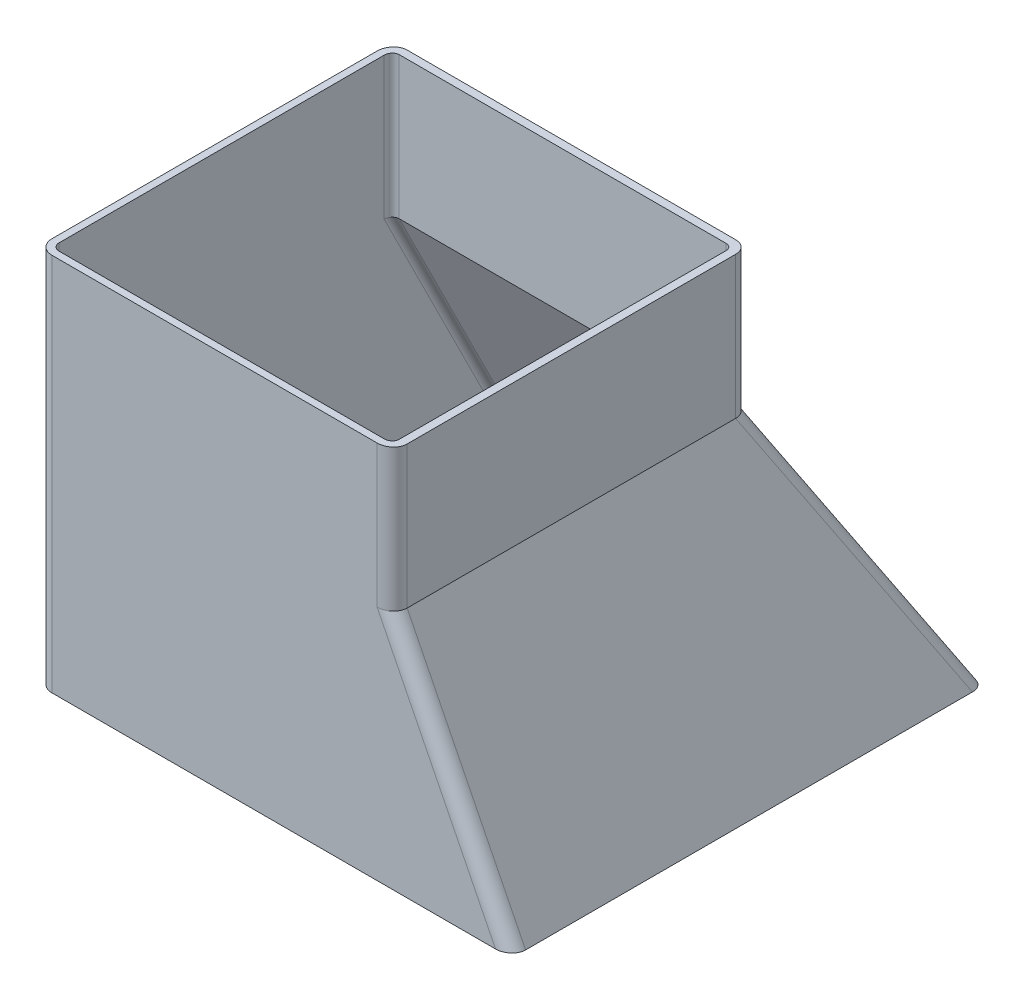
ISO-10303-21;
HEADER;
FILE_DESCRIPTION(('STEP AP214'),'2;1');
FILE_NAME('part.step','',(''),(''),'','','');
FILE_SCHEMA(('AUTOMOTIVE_DESIGN { 1 0 10303 214 1 1 1 1 }'));
ENDSEC;
DATA;
#1=APPLICATION_CONTEXT('core data for automotive mechanical design processes');
#2=APPLICATION_PROTOCOL_DEFINITION('international standard','automotive_design',2000,#1);
#3=PRODUCT_CONTEXT('',#1,'mechanical');
#4=PRODUCT('Part','Part','',(#3));
#5=PRODUCT_RELATED_PRODUCT_CATEGORY('part','',(#4));
#6=PRODUCT_DEFINITION_FORMATION('','',#4);
#7=PRODUCT_DEFINITION_CONTEXT('part definition',#1,'design');
#8=PRODUCT_DEFINITION('design','',#6,#7);
#9=PRODUCT_DEFINITION_SHAPE('','',#8);
#10=(LENGTH_UNIT() NAMED_UNIT(*) SI_UNIT(.MILLI.,.METRE.));
#11=(NAMED_UNIT(*) PLANE_ANGLE_UNIT() SI_UNIT($,.RADIAN.));
#12=(NAMED_UNIT(*) SI_UNIT($,.STERADIAN.) SOLID_ANGLE_UNIT());
#13=UNCERTAINTY_MEASURE_WITH_UNIT(LENGTH_MEASURE(1.E-05),#10,'distance_accuracy_value','');
#14=(GEOMETRIC_REPRESENTATION_CONTEXT(3) GLOBAL_UNCERTAINTY_ASSIGNED_CONTEXT((#13)) GLOBAL_UNIT_ASSIGNED_CONTEXT((#10,
#11,#12)) REPRESENTATION_CONTEXT('',''));
#15=CARTESIAN_POINT('',(0.,0.,0.));
#16=DIRECTION('',(0.,0.,1.));
#17=DIRECTION('',(1.,0.,0.));
#18=AXIS2_PLACEMENT_3D('',#15,#16,#17);
#19=CARTESIAN_POINT('',(71.9813082303753,80.,-73.3229490168752));
#20=DIRECTION('',(0.,0.,1.));
#21=DIRECTION('',(1.,0.,0.));
#22=AXIS2_PLACEMENT_3D('',#19,#20,#21);
#23=PLANE('',#22);
#24=DIRECTION('',(-1.,0.,0.));
#25=VECTOR('',#24,1.);
#26=CARTESIAN_POINT('',(0.,50.,-73.3229490168752));
#27=LINE('',#26,#25);
#28=CARTESIAN_POINT('',(71.9813082303753,50.,-73.3229490168752));
#29=VERTEX_POINT('',#28);
#30=CARTESIAN_POINT('',(3.,50.,-73.3229490168752));
#31=VERTEX_POINT('',#30);
#32=EDGE_CURVE('E233',#29,#31,#27,.T.);
#33=ORIENTED_EDGE('',*,*,#32,.F.);
#34=DIRECTION('',(0.,-1.,0.));
#35=VECTOR('',#34,1.);
#36=CARTESIAN_POINT('',(71.9813082303753,80.,-73.3229490168752));
#37=LINE('',#36,#35);
#38=CARTESIAN_POINT('',(71.9813082303753,80.,-73.3229490168752));
#39=VERTEX_POINT('',#38);
#40=EDGE_CURVE('E11',#39,#29,#37,.T.);
#41=ORIENTED_EDGE('',*,*,#40,.F.);
#42=DIRECTION('',(-1.,0.,0.));
#43=VECTOR('',#42,1.);
#44=CARTESIAN_POINT('',(71.9813082303753,80.,-73.3229490168752));
#45=LINE('',#44,#43);
#46=CARTESIAN_POINT('',(3.,80.,-73.3229490168752));
#47=VERTEX_POINT('',#46);
#48=EDGE_CURVE('E151',#39,#47,#45,.T.);
#49=ORIENTED_EDGE('',*,*,#48,.T.);
#50=DIRECTION('',(0.,-1.,0.));
#51=VECTOR('',#50,1.);
#52=CARTESIAN_POINT('',(3.,80.,-73.3229490168752));
#53=LINE('',#52,#51);
#54=EDGE_CURVE('E136',#47,#31,#53,.T.);
#55=ORIENTED_EDGE('',*,*,#54,.T.);
#56=EDGE_LOOP('',(#33,#41,#49,#55));
#57=FACE_BOUND('',#56,.T.);
#58=ADVANCED_FACE('F17',(#57),#23,.T.);
#59=CARTESIAN_POINT('',(73.3229490168752,80.,-71.9813082303753));
#60=CARTESIAN_POINT('',(73.3229490168752,50.,-71.9813082303753));
#61=CARTESIAN_POINT('',(73.3229490168752,80.,-72.7966488864589));
#62=CARTESIAN_POINT('',(73.3229490168752,50.,-72.7966488864589));
#63=CARTESIAN_POINT('',(72.7966488864589,80.,-73.3229490168752));
#64=CARTESIAN_POINT('',(72.7966488864589,50.,-73.3229490168752));
#65=CARTESIAN_POINT('',(71.9813082303753,80.,-73.3229490168752));
#66=CARTESIAN_POINT('',(71.9813082303753,50.,-73.3229490168752));
#67=(BOUNDED_SURFACE() B_SPLINE_SURFACE(3,1,((#59,#60),(#61,#62),(#63,#64),(#65,#66)),
.UNSPECIFIED.,.F.,.F.,.F.) B_SPLINE_SURFACE_WITH_KNOTS((4,4),(2,2),(0.,1.),(0.,1.),
.UNSPECIFIED.) GEOMETRIC_REPRESENTATION_ITEM() RATIONAL_B_SPLINE_SURFACE(((1.,1.),
(0.849731112827655,0.849731112827655),(0.849731112827655,0.849731112827655),(1.,1.))) REPRESENTATION_ITEM('') SURFACE());
#68=CARTESIAN_POINT('',(71.9813082303753,50.,-73.3229490168752));
#69=CARTESIAN_POINT('',(72.7966488864589,50.,-73.3229490168752));
#70=CARTESIAN_POINT('',(73.3229490168752,50.,-72.796648886459));
#71=CARTESIAN_POINT('',(73.3229490168752,50.,-71.9813082303753));
#72=(BOUNDED_CURVE() B_SPLINE_CURVE(3,(#68,#69,#70,#71),.UNSPECIFIED.,.F.,
.F.) B_SPLINE_CURVE_WITH_KNOTS((4,4),(2.45687345058751,3.82631185659208),
.UNSPECIFIED.) CURVE() GEOMETRIC_REPRESENTATION_ITEM() RATIONAL_B_SPLINE_CURVE((1.,
0.849731112827657,0.849731112827657,1.)) REPRESENTATION_ITEM(''));
#73=CARTESIAN_POINT('',(73.3229490168752,50.,-71.9813082303753));
#74=VERTEX_POINT('',#73);
#75=EDGE_CURVE('E297',#29,#74,#72,.T.);
#76=DIRECTION('',(0.,-1.,0.));
#77=VECTOR('',#76,1.);
#78=CARTESIAN_POINT('',(73.3229490168752,80.,-71.9813082303753));
#79=LINE('',#78,#77);
#80=CARTESIAN_POINT('',(73.3229490168752,80.,-71.9813082303753));
#81=VERTEX_POINT('',#80);
#82=EDGE_CURVE('E25',#81,#74,#79,.T.);
#83=CARTESIAN_POINT('',(73.3229490168752,80.,-71.9813082303753));
#84=CARTESIAN_POINT('',(73.3229490168752,80.,-72.7966488864589));
#85=CARTESIAN_POINT('',(72.7966488864589,80.,-73.3229490168752));
#86=CARTESIAN_POINT('',(71.9813082303753,80.,-73.3229490168752));
#87=(BOUNDED_CURVE() B_SPLINE_CURVE(3,(#83,#84,#85,#86),.UNSPECIFIED.,.F.,
.F.) B_SPLINE_CURVE_WITH_KNOTS((4,4),(2.45687345058751,3.82631185659208),
.UNSPECIFIED.) CURVE() GEOMETRIC_REPRESENTATION_ITEM() RATIONAL_B_SPLINE_CURVE((1.,
0.849731112827655,0.849731112827655,1.)) REPRESENTATION_ITEM(''));
#88=EDGE_CURVE('E155',#81,#39,#87,.T.);
#89=ORIENTED_EDGE('',*,*,#75,.T.);
#90=ORIENTED_EDGE('',*,*,#82,.F.);
#91=ORIENTED_EDGE('',*,*,#88,.T.);
#92=ORIENTED_EDGE('',*,*,#40,.T.);
#93=EDGE_LOOP('',(#89,#90,#91,#92));
#94=FACE_BOUND('',#93,.T.);
#95=ADVANCED_FACE('F1073',(#94),#67,.T.);
#96=CARTESIAN_POINT('',(73.3229490168752,80.,-3.));
#97=DIRECTION('',(-1.,0.,0.));
#98=DIRECTION('',(0.,1.,0.));
#99=AXIS2_PLACEMENT_3D('',#96,#97,#98);
#100=PLANE('',#99);
#101=DIRECTION('',(0.,0.,-1.));
#102=VECTOR('',#101,1.);
#103=CARTESIAN_POINT('',(73.3229490168752,50.,0.));
#104=LINE('',#103,#102);
#105=CARTESIAN_POINT('',(73.3229490168752,50.,-3.));
#106=VERTEX_POINT('',#105);
#107=EDGE_CURVE('E262',#106,#74,#104,.T.);
#108=ORIENTED_EDGE('',*,*,#107,.F.);
#109=DIRECTION('',(0.,-1.,0.));
#110=VECTOR('',#109,1.);
#111=CARTESIAN_POINT('',(73.3229490168752,80.,-3.));
#112=LINE('',#111,#110);
#113=CARTESIAN_POINT('',(73.3229490168752,80.,-3.));
#114=VERTEX_POINT('',#113);
#115=EDGE_CURVE('E38',#114,#106,#112,.T.);
#116=ORIENTED_EDGE('',*,*,#115,.F.);
#117=DIRECTION('',(0.,0.,-1.));
#118=VECTOR('',#117,1.);
#119=CARTESIAN_POINT('',(73.3229490168752,80.,-3.));
#120=LINE('',#119,#118);
#121=EDGE_CURVE('E186',#114,#81,#120,.T.);
#122=ORIENTED_EDGE('',*,*,#121,.T.);
#123=ORIENTED_EDGE('',*,*,#82,.T.);
#124=EDGE_LOOP('',(#108,#116,#122,#123));
#125=FACE_BOUND('',#124,.T.);
#126=ADVANCED_FACE('F1068',(#125),#100,.T.);
#127=CARTESIAN_POINT('',(71.6458980337503,80.,-1.5));
#128=CARTESIAN_POINT('',(71.6458980337503,50.,-1.5));
#129=CARTESIAN_POINT('',(72.6282917548738,80.0000000000001,-1.49999999999999));
#130=CARTESIAN_POINT('',(72.6282917548738,50.,-1.49999999999999));
#131=CARTESIAN_POINT('',(73.3229490168752,80.0000000000001,-2.12132034355964));
#132=CARTESIAN_POINT('',(73.3229490168752,50.,-2.12132034355964));
#133=CARTESIAN_POINT('',(73.3229490168752,80.,-3.));
#134=CARTESIAN_POINT('',(73.3229490168752,50.,-3.));
#135=(BOUNDED_SURFACE() B_SPLINE_SURFACE(3,1,((#127,#128),(#129,#130),(#131,#132),(#133,#134)),
.UNSPECIFIED.,.F.,.F.,.F.) B_SPLINE_SURFACE_WITH_KNOTS((4,4),(2,2),(0.,1.),(0.,1.),
.UNSPECIFIED.) GEOMETRIC_REPRESENTATION_ITEM() RATIONAL_B_SPLINE_SURFACE(((1.,1.),
(0.804737854124363,0.804737854124363),(0.804737854124363,0.804737854124363),(1.,1.))) REPRESENTATION_ITEM('') SURFACE());
#136=CARTESIAN_POINT('',(73.3229490168752,50.,-3.));
#137=CARTESIAN_POINT('',(73.3229490168752,50.,-2.12132034355964));
#138=CARTESIAN_POINT('',(72.6282917548738,50.,-1.49999999999999));
#139=CARTESIAN_POINT('',(71.6458980337503,50.,-1.5));
#140=(BOUNDED_CURVE() B_SPLINE_CURVE(3,(#136,#137,#138,#139),.UNSPECIFIED.,.F.,
.F.) B_SPLINE_CURVE_WITH_KNOTS((4,4),(3.1415926535898,4.7123889803847),
.UNSPECIFIED.) CURVE() GEOMETRIC_REPRESENTATION_ITEM() RATIONAL_B_SPLINE_CURVE((1.,
0.804737854124363,0.804737854124363,1.)) REPRESENTATION_ITEM(''));
#141=CARTESIAN_POINT('',(71.6458980337503,50.,-1.5));
#142=VERTEX_POINT('',#141);
#143=EDGE_CURVE('E292',#106,#142,#140,.T.);
#144=DIRECTION('',(0.,-1.,0.));
#145=VECTOR('',#144,1.);
#146=CARTESIAN_POINT('',(71.6458980337503,80.,-1.5));
#147=LINE('',#146,#145);
#148=CARTESIAN_POINT('',(71.6458980337503,80.,-1.5));
#149=VERTEX_POINT('',#148);
#150=EDGE_CURVE('E218',#149,#142,#147,.T.);
#151=CARTESIAN_POINT('',(71.6458980337503,80.,-1.5));
#152=CARTESIAN_POINT('',(72.6282917548738,80.0000000000001,-1.49999999999999));
#153=CARTESIAN_POINT('',(73.3229490168752,80.0000000000001,-2.12132034355964));
#154=CARTESIAN_POINT('',(73.3229490168752,80.,-3.));
#155=(BOUNDED_CURVE() B_SPLINE_CURVE(3,(#151,#152,#153,#154),.UNSPECIFIED.,.F.,
.F.) B_SPLINE_CURVE_WITH_KNOTS((4,4),(1.57079632679489,3.1415926535898),
.UNSPECIFIED.) CURVE() GEOMETRIC_REPRESENTATION_ITEM() RATIONAL_B_SPLINE_CURVE((1.,
0.804737854124363,0.804737854124363,1.)) REPRESENTATION_ITEM(''));
#156=EDGE_CURVE('E177',#149,#114,#155,.T.);
#157=ORIENTED_EDGE('',*,*,#143,.T.);
#158=ORIENTED_EDGE('',*,*,#150,.F.);
#159=ORIENTED_EDGE('',*,*,#156,.T.);
#160=ORIENTED_EDGE('',*,*,#115,.T.);
#161=EDGE_LOOP('',(#157,#158,#159,#160));
#162=FACE_BOUND('',#161,.T.);
#163=ADVANCED_FACE('F1006',(#162),#135,.T.);
#164=CARTESIAN_POINT('',(3.,80.,-73.3229490168752));
#165=CARTESIAN_POINT('',(3.,50.,-73.3229490168752));
#166=CARTESIAN_POINT('',(2.12132034355965,80.,-73.3229490168753));
#167=CARTESIAN_POINT('',(2.12132034355965,50.,-73.3229490168753));
#168=CARTESIAN_POINT('',(1.5,80.,-72.6282917548737));
#169=CARTESIAN_POINT('',(1.5,50.,-72.6282917548737));
#170=CARTESIAN_POINT('',(1.5,80.,-71.6458980337503));
#171=CARTESIAN_POINT('',(1.5,50.,-71.6458980337503));
#172=(BOUNDED_SURFACE() B_SPLINE_SURFACE(3,1,((#164,#165),(#166,#167),(#168,#169),(#170,#171)),
.UNSPECIFIED.,.F.,.F.,.F.) B_SPLINE_SURFACE_WITH_KNOTS((4,4),(2,2),(0.,1.),(0.,1.),
.UNSPECIFIED.) GEOMETRIC_REPRESENTATION_ITEM() RATIONAL_B_SPLINE_SURFACE(((1.,1.),
(0.804737854124365,0.804737854124365),(0.804737854124365,0.804737854124365),(1.,1.))) REPRESENTATION_ITEM('') SURFACE());
#173=CARTESIAN_POINT('',(1.5,50.,-71.6458980337503));
#174=CARTESIAN_POINT('',(1.5,50.,-72.6282917548737));
#175=CARTESIAN_POINT('',(2.12132034355964,50.,-73.3229490168751));
#176=CARTESIAN_POINT('',(3.,50.,-73.3229490168752));
#177=(BOUNDED_CURVE() B_SPLINE_CURVE(3,(#173,#174,#175,#176),.UNSPECIFIED.,.F.,
.F.) B_SPLINE_CURVE_WITH_KNOTS((4,4),(1.5707963267949,3.1415926535898),
.UNSPECIFIED.) CURVE() GEOMETRIC_REPRESENTATION_ITEM() RATIONAL_B_SPLINE_CURVE((1.,
0.804737854124365,0.804737854124365,1.)) REPRESENTATION_ITEM(''));
#178=CARTESIAN_POINT('',(1.5,50.,-71.6458980337503));
#179=VERTEX_POINT('',#178);
#180=EDGE_CURVE('E143',#179,#31,#177,.T.);
#181=CARTESIAN_POINT('',(3.,80.,-73.3229490168752));
#182=CARTESIAN_POINT('',(2.12132034355965,80.,-73.3229490168753));
#183=CARTESIAN_POINT('',(1.5,80.,-72.6282917548737));
#184=CARTESIAN_POINT('',(1.5,80.,-71.6458980337503));
#185=(BOUNDED_CURVE() B_SPLINE_CURVE(3,(#181,#182,#183,#184),.UNSPECIFIED.,.F.,
.F.) B_SPLINE_CURVE_WITH_KNOTS((4,4),(3.14159265358979,4.71238898038469),
.UNSPECIFIED.) CURVE() GEOMETRIC_REPRESENTATION_ITEM() RATIONAL_B_SPLINE_CURVE((1.,
0.804737854124365,0.804737854124365,1.)) REPRESENTATION_ITEM(''));
#186=CARTESIAN_POINT('',(1.5,80.,-71.6458980337503));
#187=VERTEX_POINT('',#186);
#188=EDGE_CURVE('E141',#47,#187,#185,.T.);
#189=DIRECTION('',(0.,-1.,0.));
#190=VECTOR('',#189,1.);
#191=CARTESIAN_POINT('',(1.5,80.,-71.6458980337503));
#192=LINE('',#191,#190);
#193=EDGE_CURVE('E249',#187,#179,#192,.T.);
#194=ORIENTED_EDGE('',*,*,#180,.T.);
#195=ORIENTED_EDGE('',*,*,#54,.F.);
#196=ORIENTED_EDGE('',*,*,#188,.T.);
#197=ORIENTED_EDGE('',*,*,#193,.T.);
#198=EDGE_LOOP('',(#194,#195,#196,#197));
#199=FACE_BOUND('',#198,.T.);
#200=ADVANCED_FACE('F138',(#199),#172,.T.);
#201=CARTESIAN_POINT('',(75.,80.,-3.));
#202=DIRECTION('',(-1.,0.,0.));
#203=DIRECTION('',(0.,1.,0.));
#204=AXIS2_PLACEMENT_3D('',#201,#202,#203);
#205=PLANE('',#204);
#206=DIRECTION('',(0.,0.,-1.));
#207=VECTOR('',#206,1.);
#208=CARTESIAN_POINT('',(75.,50.,0.));
#209=LINE('',#208,#207);
#210=CARTESIAN_POINT('',(75.,50.,-3.));
#211=VERTEX_POINT('',#210);
#212=CARTESIAN_POINT('',(75.,50.,-72.3167184270003));
#213=VERTEX_POINT('',#212);
#214=EDGE_CURVE('E207',#211,#213,#209,.T.);
#215=ORIENTED_EDGE('',*,*,#214,.T.);
#216=DIRECTION('',(0.,-1.,0.));
#217=VECTOR('',#216,1.);
#218=CARTESIAN_POINT('',(75.,80.,-72.3167184270003));
#219=LINE('',#218,#217);
#220=CARTESIAN_POINT('',(75.,80.,-72.3167184270003));
#221=VERTEX_POINT('',#220);
#222=EDGE_CURVE('E187',#221,#213,#219,.T.);
#223=ORIENTED_EDGE('',*,*,#222,.F.);
#224=DIRECTION('',(0.,0.,-1.));
#225=VECTOR('',#224,1.);
#226=CARTESIAN_POINT('',(75.,80.,-3.));
#227=LINE('',#226,#225);
#228=CARTESIAN_POINT('',(75.,80.,-3.));
#229=VERTEX_POINT('',#228);
#230=EDGE_CURVE('E164',#229,#221,#227,.T.);
#231=ORIENTED_EDGE('',*,*,#230,.F.);
#232=DIRECTION('',(0.,-1.,0.));
#233=VECTOR('',#232,1.);
#234=CARTESIAN_POINT('',(75.,80.,-3.));
#235=LINE('',#234,#233);
#236=EDGE_CURVE('E148',#229,#211,#235,.T.);
#237=ORIENTED_EDGE('',*,*,#236,.T.);
#238=EDGE_LOOP('',(#215,#223,#231,#237));
#239=FACE_BOUND('',#238,.T.);
#240=ADVANCED_FACE('F350',(#239),#205,.F.);
#241=CARTESIAN_POINT('',(71.6458980337503,80.,0.));
#242=CARTESIAN_POINT('',(71.6458980337503,50.,0.));
#243=CARTESIAN_POINT('',(73.6106854759971,80.,0.));
#244=CARTESIAN_POINT('',(73.6106854759971,50.,0.));
#245=CARTESIAN_POINT('',(75.,80.,-1.24264068711929));
#246=CARTESIAN_POINT('',(75.,50.,-1.24264068711929));
#247=CARTESIAN_POINT('',(75.,80.,-3.));
#248=CARTESIAN_POINT('',(75.,50.,-3.));
#249=(BOUNDED_SURFACE() B_SPLINE_SURFACE(3,1,((#241,#242),(#243,#244),(#245,#246),(#247,#248)),
.UNSPECIFIED.,.F.,.F.,.F.) B_SPLINE_SURFACE_WITH_KNOTS((4,4),(2,2),(0.,1.),(0.,1.),
.UNSPECIFIED.) GEOMETRIC_REPRESENTATION_ITEM() RATIONAL_B_SPLINE_SURFACE(((1.,1.),
(0.804737854124364,0.804737854124364),(0.804737854124364,0.804737854124364),(1.,1.))) REPRESENTATION_ITEM('') SURFACE());
#250=CARTESIAN_POINT('',(71.6458980337503,50.,0.));
#251=CARTESIAN_POINT('',(73.6106854759971,50.,0.));
#252=CARTESIAN_POINT('',(75.,50.,-1.24264068711929));
#253=CARTESIAN_POINT('',(75.,50.,-3.));
#254=(BOUNDED_CURVE() B_SPLINE_CURVE(3,(#250,#251,#252,#253),.UNSPECIFIED.,.F.,
.F.) B_SPLINE_CURVE_WITH_KNOTS((4,4),(4.71238898038469,6.28318530717959),
.UNSPECIFIED.) CURVE() GEOMETRIC_REPRESENTATION_ITEM() RATIONAL_B_SPLINE_CURVE((1.,
0.804737854124365,0.804737854124365,1.)) REPRESENTATION_ITEM(''));
#255=CARTESIAN_POINT('',(71.6458980337503,50.,0.));
#256=VERTEX_POINT('',#255);
#257=EDGE_CURVE('E285',#256,#211,#254,.T.);
#258=CARTESIAN_POINT('',(71.6458980337503,80.,0.));
#259=CARTESIAN_POINT('',(73.6106854759971,80.,0.));
#260=CARTESIAN_POINT('',(75.,80.,-1.24264068711929));
#261=CARTESIAN_POINT('',(75.,80.,-3.));
#262=(BOUNDED_CURVE() B_SPLINE_CURVE(3,(#258,#259,#260,#261),.UNSPECIFIED.,.F.,
.F.) B_SPLINE_CURVE_WITH_KNOTS((4,4),(4.71238898038469,6.28318530717959),
.UNSPECIFIED.) CURVE() GEOMETRIC_REPRESENTATION_ITEM() RATIONAL_B_SPLINE_CURVE((1.,
0.804737854124364,0.804737854124364,1.)) REPRESENTATION_ITEM(''));
#263=CARTESIAN_POINT('',(71.6458980337503,80.,0.));
#264=VERTEX_POINT('',#263);
#265=EDGE_CURVE('E171',#264,#229,#262,.T.);
#266=DIRECTION('',(0.,-1.,0.));
#267=VECTOR('',#266,1.);
#268=CARTESIAN_POINT('',(71.6458980337503,80.,0.));
#269=LINE('',#268,#267);
#270=EDGE_CURVE('E227',#264,#256,#269,.T.);
#271=ORIENTED_EDGE('',*,*,#257,.T.);
#272=ORIENTED_EDGE('',*,*,#236,.F.);
#273=ORIENTED_EDGE('',*,*,#265,.F.);
#274=ORIENTED_EDGE('',*,*,#270,.T.);
#275=EDGE_LOOP('',(#271,#272,#273,#274));
#276=FACE_BOUND('',#275,.T.);
#277=ADVANCED_FACE('F347',(#276),#249,.F.);
#278=CARTESIAN_POINT('',(3.,80.,-75.));
#279=CARTESIAN_POINT('',(3.,50.,-75.));
#280=CARTESIAN_POINT('',(1.24264068711928,80.,-75.0000000000001));
#281=CARTESIAN_POINT('',(1.24264068711928,50.,-75.0000000000001));
#282=CARTESIAN_POINT('',(0.,80.,-73.6106854759972));
#283=CARTESIAN_POINT('',(0.,50.,-73.6106854759972));
#284=CARTESIAN_POINT('',(0.,80.,-71.6458980337504));
#285=CARTESIAN_POINT('',(0.,50.,-71.6458980337504));
#286=(BOUNDED_SURFACE() B_SPLINE_SURFACE(3,1,((#278,#279),(#280,#281),(#282,#283),(#284,#285)),
.UNSPECIFIED.,.F.,.F.,.F.) B_SPLINE_SURFACE_WITH_KNOTS((4,4),(2,2),(0.,1.),(0.,1.),
.UNSPECIFIED.) GEOMETRIC_REPRESENTATION_ITEM() RATIONAL_B_SPLINE_SURFACE(((1.,1.),
(0.804737854124366,0.804737854124366),(0.804737854124366,0.804737854124366),(1.,1.))) REPRESENTATION_ITEM('') SURFACE());
#287=CARTESIAN_POINT('',(3.,50.,-75.));
#288=CARTESIAN_POINT('',(1.24264068711929,50.,-75.));
#289=CARTESIAN_POINT('',(0.,50.,-73.6106854759973));
#290=CARTESIAN_POINT('',(0.,50.,-71.6458980337504));
#291=(BOUNDED_CURVE() B_SPLINE_CURVE(3,(#287,#288,#289,#290),.UNSPECIFIED.,.F.,
.F.) B_SPLINE_CURVE_WITH_KNOTS((4,4),(0.,1.5707963267949),
.UNSPECIFIED.) CURVE() GEOMETRIC_REPRESENTATION_ITEM() RATIONAL_B_SPLINE_CURVE((1.,
0.804737854124365,0.804737854124365,1.)) REPRESENTATION_ITEM(''));
#292=CARTESIAN_POINT('',(3.,50.,-75.));
#293=VERTEX_POINT('',#292);
#294=CARTESIAN_POINT('',(0.,50.,-71.6458980337504));
#295=VERTEX_POINT('',#294);
#296=EDGE_CURVE('E270',#293,#295,#291,.T.);
#297=DIRECTION('',(0.,-1.,0.));
#298=VECTOR('',#297,1.);
#299=CARTESIAN_POINT('',(0.,80.,-71.6458980337504));
#300=LINE('',#299,#298);
#301=CARTESIAN_POINT('',(0.,80.,-71.6458980337504));
#302=VERTEX_POINT('',#301);
#303=EDGE_CURVE('E483',#302,#295,#300,.T.);
#304=CARTESIAN_POINT('',(3.,80.,-75.));
#305=CARTESIAN_POINT('',(1.24264068711928,80.,-75.0000000000001));
#306=CARTESIAN_POINT('',(0.,80.,-73.6106854759972));
#307=CARTESIAN_POINT('',(0.,80.,-71.6458980337504));
#308=(BOUNDED_CURVE() B_SPLINE_CURVE(3,(#304,#305,#306,#307),.UNSPECIFIED.,.F.,
.F.) B_SPLINE_CURVE_WITH_KNOTS((4,4),(0.,1.57079632679489),
.UNSPECIFIED.) CURVE() GEOMETRIC_REPRESENTATION_ITEM() RATIONAL_B_SPLINE_CURVE((1.,
0.804737854124366,0.804737854124366,1.)) REPRESENTATION_ITEM(''));
#309=CARTESIAN_POINT('',(3.,80.,-75.));
#310=VERTEX_POINT('',#309);
#311=EDGE_CURVE('E317',#310,#302,#308,.T.);
#312=DIRECTION('',(0.,-1.,0.));
#313=VECTOR('',#312,1.);
#314=CARTESIAN_POINT('',(3.,80.,-75.));
#315=LINE('',#314,#313);
#316=EDGE_CURVE('E193',#310,#293,#315,.T.);
#317=ORIENTED_EDGE('',*,*,#296,.T.);
#318=ORIENTED_EDGE('',*,*,#303,.F.);
#319=ORIENTED_EDGE('',*,*,#311,.F.);
#320=ORIENTED_EDGE('',*,*,#316,.T.);
#321=EDGE_LOOP('',(#317,#318,#319,#320));
#322=FACE_BOUND('',#321,.T.);
#323=ADVANCED_FACE('F571',(#322),#286,.F.);
#324=CARTESIAN_POINT('',(72.3167184270002,80.,-75.));
#325=DIRECTION('',(0.,0.,1.));
#326=DIRECTION('',(1.,0.,0.));
#327=AXIS2_PLACEMENT_3D('',#324,#325,#326);
#328=PLANE('',#327);
#329=DIRECTION('',(-1.,0.,0.));
#330=VECTOR('',#329,1.);
#331=CARTESIAN_POINT('',(0.,50.,-75.));
#332=LINE('',#331,#330);
#333=CARTESIAN_POINT('',(72.3167184270002,50.,-75.));
#334=VERTEX_POINT('',#333);
#335=EDGE_CURVE('E378',#334,#293,#332,.T.);
#336=ORIENTED_EDGE('',*,*,#335,.T.);
#337=ORIENTED_EDGE('',*,*,#316,.F.);
#338=DIRECTION('',(-1.,0.,0.));
#339=VECTOR('',#338,1.);
#340=CARTESIAN_POINT('',(72.3167184270002,80.,-75.));
#341=LINE('',#340,#339);
#342=CARTESIAN_POINT('',(72.3167184270002,80.,-75.));
#343=VERTEX_POINT('',#342);
#344=EDGE_CURVE('E310',#343,#310,#341,.T.);
#345=ORIENTED_EDGE('',*,*,#344,.F.);
#346=DIRECTION('',(0.,-1.,0.));
#347=VECTOR('',#346,1.);
#348=CARTESIAN_POINT('',(72.3167184270002,80.,-75.));
#349=LINE('',#348,#347);
#350=EDGE_CURVE('E185',#343,#334,#349,.T.);
#351=ORIENTED_EDGE('',*,*,#350,.T.);
#352=EDGE_LOOP('',(#336,#337,#345,#351));
#353=FACE_BOUND('',#352,.T.);
#354=ADVANCED_FACE('F582',(#353),#328,.F.);
#355=CARTESIAN_POINT('',(75.,80.,-72.3167184270003));
#356=CARTESIAN_POINT('',(75.,50.,-72.3167184270003));
#357=CARTESIAN_POINT('',(75.,80.,-73.9473997391674));
#358=CARTESIAN_POINT('',(75.,50.,-73.9473997391674));
#359=CARTESIAN_POINT('',(73.9473997391674,80.,-75.0000000000001));
#360=CARTESIAN_POINT('',(73.9473997391674,50.,-75.0000000000001));
#361=CARTESIAN_POINT('',(72.3167184270002,80.,-75.));
#362=CARTESIAN_POINT('',(72.3167184270002,50.,-75.));
#363=(BOUNDED_SURFACE() B_SPLINE_SURFACE(3,1,((#355,#356),(#357,#358),(#359,#360),(#361,#362)),
.UNSPECIFIED.,.F.,.F.,.F.) B_SPLINE_SURFACE_WITH_KNOTS((4,4),(2,2),(0.,1.),(0.,1.),
.UNSPECIFIED.) GEOMETRIC_REPRESENTATION_ITEM() RATIONAL_B_SPLINE_SURFACE(((1.,1.),
(0.849731112827654,0.849731112827654),(0.849731112827654,0.849731112827654),(1.,1.))) REPRESENTATION_ITEM('') SURFACE());
#364=CARTESIAN_POINT('',(75.,50.,-72.3167184270003));
#365=CARTESIAN_POINT('',(75.,50.,-73.9473997391674));
#366=CARTESIAN_POINT('',(73.9473997391674,50.,-75.0000000000001));
#367=CARTESIAN_POINT('',(72.3167184270002,50.,-75.));
#368=(BOUNDED_CURVE() B_SPLINE_CURVE(3,(#364,#365,#366,#367),.UNSPECIFIED.,.F.,
.F.) B_SPLINE_CURVE_WITH_KNOTS((4,4),(5.5984661041773,6.96790451018188),
.UNSPECIFIED.) CURVE() GEOMETRIC_REPRESENTATION_ITEM() RATIONAL_B_SPLINE_CURVE((1.,
0.849731112827654,0.849731112827654,1.)) REPRESENTATION_ITEM(''));
#369=EDGE_CURVE('E276',#213,#334,#368,.T.);
#370=CARTESIAN_POINT('',(75.,80.,-72.3167184270003));
#371=CARTESIAN_POINT('',(75.,80.,-73.9473997391674));
#372=CARTESIAN_POINT('',(73.9473997391674,80.,-75.0000000000001));
#373=CARTESIAN_POINT('',(72.3167184270002,80.,-75.));
#374=(BOUNDED_CURVE() B_SPLINE_CURVE(3,(#370,#371,#372,#373),.UNSPECIFIED.,.F.,
.F.) B_SPLINE_CURVE_WITH_KNOTS((4,4),(5.5984661041773,6.96790451018188),
.UNSPECIFIED.) CURVE() GEOMETRIC_REPRESENTATION_ITEM() RATIONAL_B_SPLINE_CURVE((1.,
0.849731112827654,0.849731112827654,1.)) REPRESENTATION_ITEM(''));
#375=EDGE_CURVE('E304',#221,#343,#374,.T.);
#376=ORIENTED_EDGE('',*,*,#369,.T.);
#377=ORIENTED_EDGE('',*,*,#350,.F.);
#378=ORIENTED_EDGE('',*,*,#375,.F.);
#379=ORIENTED_EDGE('',*,*,#222,.T.);
#380=EDGE_LOOP('',(#376,#377,#378,#379));
#381=FACE_BOUND('',#380,.T.);
#382=ADVANCED_FACE('F355',(#381),#363,.F.);
#383=CARTESIAN_POINT('',(71.6458980337503,80.,-71.6458980337503));
#384=DIRECTION('',(0.,1.,0.));
#385=DIRECTION('',(1.,0.,0.));
#386=AXIS2_PLACEMENT_3D('',#383,#384,#385);
#387=PLANE('',#386);
#388=DIRECTION('',(0.,0.,1.));
#389=VECTOR('',#388,1.);
#390=CARTESIAN_POINT('',(1.5,80.,-71.6458980337503));
#391=LINE('',#390,#389);
#392=CARTESIAN_POINT('',(1.5,80.,-3.));
#393=VERTEX_POINT('',#392);
#394=EDGE_CURVE('E161',#187,#393,#391,.T.);
#395=ORIENTED_EDGE('',*,*,#394,.F.);
#396=ORIENTED_EDGE('',*,*,#188,.F.);
#397=ORIENTED_EDGE('',*,*,#48,.F.);
#398=ORIENTED_EDGE('',*,*,#88,.F.);
#399=ORIENTED_EDGE('',*,*,#121,.F.);
#400=ORIENTED_EDGE('',*,*,#156,.F.);
#401=DIRECTION('',(1.,0.,0.));
#402=VECTOR('',#401,1.);
#403=CARTESIAN_POINT('',(3.,80.,-1.5));
#404=LINE('',#403,#402);
#405=CARTESIAN_POINT('',(3.,80.,-1.5));
#406=VERTEX_POINT('',#405);
#407=EDGE_CURVE('E214',#406,#149,#404,.T.);
#408=ORIENTED_EDGE('',*,*,#407,.F.);
#409=CARTESIAN_POINT('',(3.,80.,-3.));
#410=DIRECTION('',(0.,1.,0.));
#411=DIRECTION('',(0.,0.,1.));
#412=AXIS2_PLACEMENT_3D('',#409,#410,#411);
#413=CIRCLE('',#412,1.5);
#414=EDGE_CURVE('E298',#393,#406,#413,.T.);
#415=ORIENTED_EDGE('',*,*,#414,.F.);
#416=EDGE_LOOP('',(#395,#396,#397,#398,#399,#400,#408,#415));
#417=FACE_BOUND('',#416,.T.);
#418=ORIENTED_EDGE('',*,*,#375,.T.);
#419=ORIENTED_EDGE('',*,*,#344,.T.);
#420=ORIENTED_EDGE('',*,*,#311,.T.);
#421=DIRECTION('',(0.,0.,1.));
#422=VECTOR('',#421,1.);
#423=CARTESIAN_POINT('',(0.,80.,-71.6458980337504));
#424=LINE('',#423,#422);
#425=CARTESIAN_POINT('',(0.,80.,-3.));
#426=VERTEX_POINT('',#425);
#427=EDGE_CURVE('E476',#302,#426,#424,.T.);
#428=ORIENTED_EDGE('',*,*,#427,.T.);
#429=CARTESIAN_POINT('',(3.,80.,-3.));
#430=DIRECTION('',(0.,1.,0.));
#431=DIRECTION('',(0.,0.,1.));
#432=AXIS2_PLACEMENT_3D('',#429,#430,#431);
#433=CIRCLE('',#432,3.);
#434=CARTESIAN_POINT('',(3.,80.,0.));
#435=VERTEX_POINT('',#434);
#436=EDGE_CURVE('E286',#426,#435,#433,.T.);
#437=ORIENTED_EDGE('',*,*,#436,.T.);
#438=DIRECTION('',(1.,0.,0.));
#439=VECTOR('',#438,1.);
#440=CARTESIAN_POINT('',(3.,80.,0.));
#441=LINE('',#440,#439);
#442=EDGE_CURVE('E228',#435,#264,#441,.T.);
#443=ORIENTED_EDGE('',*,*,#442,.T.);
#444=ORIENTED_EDGE('',*,*,#265,.T.);
#445=ORIENTED_EDGE('',*,*,#230,.T.);
#446=EDGE_LOOP('',(#418,#419,#420,#428,#437,#443,#444,#445));
#447=FACE_BOUND('',#446,.T.);
#448=ADVANCED_FACE('F157',(#417,#447),#387,.T.);
#449=CARTESIAN_POINT('',(3.,38.6583592135001,-77.3167184270003));
#450=DIRECTION('',(0.,0.894427190999916,0.447213595499958));
#451=DIRECTION('',(0.,-0.447213595499958,0.894427190999916));
#452=AXIS2_PLACEMENT_3D('',#449,#450,#451);
#453=CYLINDRICAL_SURFACE('',#452,1.5);
#454=ORIENTED_EDGE('',*,*,#180,.F.);
#455=DIRECTION('',(0.,0.894427190999916,0.447213595499958));
#456=VECTOR('',#455,1.);
#457=CARTESIAN_POINT('',(1.5,49.3291796067501,-71.9813082303753));
#458=LINE('',#457,#456);
#459=CARTESIAN_POINT('',(1.49999999999997,0.,-96.6458980337504));
#460=VERTEX_POINT('',#459);
#461=EDGE_CURVE('E245',#460,#179,#458,.T.);
#462=ORIENTED_EDGE('',*,*,#461,.F.);
#463=CARTESIAN_POINT('',(3.,0.,-98.3229490168752));
#464=CARTESIAN_POINT('',(2.12132034355961,0.,-98.3229490168752));
#465=CARTESIAN_POINT('',(1.49999999999996,0.,-97.6282917548738));
#466=CARTESIAN_POINT('',(1.49999999999997,0.,-96.6458980337504));
#467=(BOUNDED_CURVE() B_SPLINE_CURVE(3,(#463,#464,#465,#466),.UNSPECIFIED.,.F.,
.F.) B_SPLINE_CURVE_WITH_KNOTS((4,4),(3.1415926535898,4.7123889803847),
.UNSPECIFIED.) CURVE() GEOMETRIC_REPRESENTATION_ITEM() RATIONAL_B_SPLINE_CURVE((1.,
0.804737854124363,0.804737854124363,1.)) REPRESENTATION_ITEM(''));
#468=CARTESIAN_POINT('',(3.,0.,-98.3229490168752));
#469=VERTEX_POINT('',#468);
#470=EDGE_CURVE('E432',#469,#460,#467,.T.);
#471=ORIENTED_EDGE('',*,*,#470,.F.);
#472=DIRECTION('',(0.,-0.894427190999916,-0.447213595499958));
#473=VECTOR('',#472,1.);
#474=CARTESIAN_POINT('',(3.,0.,-98.3229490168752));
#475=LINE('',#474,#473);
#476=EDGE_CURVE('E237',#31,#469,#475,.T.);
#477=ORIENTED_EDGE('',*,*,#476,.F.);
#478=EDGE_LOOP('',(#454,#462,#471,#477));
#479=FACE_BOUND('',#478,.T.);
#480=ADVANCED_FACE('F625',(#479),#453,.F.);
#481=CARTESIAN_POINT('',(3.,0.,-3.));
#482=DIRECTION('',(0.,1.,0.));
#483=DIRECTION('',(-1.,0.,0.));
#484=AXIS2_PLACEMENT_3D('',#481,#482,#483);
#485=CYLINDRICAL_SURFACE('',#484,1.5);
#486=DIRECTION('',(0.,-1.,0.));
#487=VECTOR('',#486,1.);
#488=CARTESIAN_POINT('',(1.5,0.,-3.));
#489=LINE('',#488,#487);
#490=CARTESIAN_POINT('',(1.5,0.,-3.));
#491=VERTEX_POINT('',#490);
#492=EDGE_CURVE('E254',#393,#491,#489,.T.);
#493=ORIENTED_EDGE('',*,*,#492,.F.);
#494=ORIENTED_EDGE('',*,*,#414,.T.);
#495=DIRECTION('',(0.,1.,0.));
#496=VECTOR('',#495,1.);
#497=CARTESIAN_POINT('',(3.,50.,-1.5));
#498=LINE('',#497,#496);
#499=CARTESIAN_POINT('',(3.,0.,-1.5));
#500=VERTEX_POINT('',#499);
#501=EDGE_CURVE('E219',#500,#406,#498,.T.);
#502=ORIENTED_EDGE('',*,*,#501,.F.);
#503=CARTESIAN_POINT('',(3.,0.,-3.));
#504=DIRECTION('',(0.,1.,0.));
#505=DIRECTION('',(0.,0.,-1.));
#506=AXIS2_PLACEMENT_3D('',#503,#504,#505);
#507=CIRCLE('',#506,1.5);
#508=EDGE_CURVE('E447',#491,#500,#507,.T.);
#509=ORIENTED_EDGE('',*,*,#508,.F.);
#510=EDGE_LOOP('',(#493,#494,#502,#509));
#511=FACE_BOUND('',#510,.T.);
#512=ADVANCED_FACE('F554',(#511),#485,.F.);
#513=CARTESIAN_POINT('',(64.4305986891669,64.4305986891669,-64.4305986891669));
#514=DIRECTION('',(-0.408248290463863,0.816496580927726,0.408248290463863));
#515=DIRECTION('',(0.,-0.447213595499958,0.894427190999916));
#516=AXIS2_PLACEMENT_3D('',#513,#514,#515);
#517=CYLINDRICAL_SURFACE('',#516,1.5);
#518=ORIENTED_EDGE('',*,*,#75,.F.);
#519=DIRECTION('',(-0.408248290463863,0.816496580927726,0.408248290463863));
#520=VECTOR('',#519,1.);
#521=CARTESIAN_POINT('',(72.2049150281253,49.5527864045001,-73.5465558146252));
#522=LINE('',#521,#520);
#523=CARTESIAN_POINT('',(96.9813082303753,0.,-98.3229490168752));
#524=VERTEX_POINT('',#523);
#525=EDGE_CURVE('E238',#524,#29,#522,.T.);
#526=ORIENTED_EDGE('',*,*,#525,.F.);
#527=CARTESIAN_POINT('',(98.3229490168752,0.,-96.9813082303753));
#528=CARTESIAN_POINT('',(98.3229490168751,0.,-97.796648886459));
#529=CARTESIAN_POINT('',(97.796648886459,0.,-98.3229490168751));
#530=CARTESIAN_POINT('',(96.9813082303753,0.,-98.3229490168752));
#531=(BOUNDED_CURVE() B_SPLINE_CURVE(3,(#527,#528,#529,#530),.UNSPECIFIED.,.F.,
.F.) B_SPLINE_CURVE_WITH_KNOTS((4,4),(2.45687345058752,3.82631185659207),
.UNSPECIFIED.) CURVE() GEOMETRIC_REPRESENTATION_ITEM() RATIONAL_B_SPLINE_CURVE((1.,
0.849731112827659,0.849731112827659,1.)) REPRESENTATION_ITEM(''));
#532=CARTESIAN_POINT('',(98.3229490168752,0.,-96.9813082303753));
#533=VERTEX_POINT('',#532);
#534=EDGE_CURVE('E420',#533,#524,#531,.T.);
#535=ORIENTED_EDGE('',*,*,#534,.F.);
#536=DIRECTION('',(0.408248290463863,-0.816496580927726,-0.408248290463863));
#537=VECTOR('',#536,1.);
#538=CARTESIAN_POINT('',(98.5465558146251,-0.447213595499966,-97.2049150281253));
#539=LINE('',#538,#537);
#540=EDGE_CURVE('E258',#74,#533,#539,.T.);
#541=ORIENTED_EDGE('',*,*,#540,.F.);
#542=EDGE_LOOP('',(#518,#526,#535,#541));
#543=FACE_BOUND('',#542,.T.);
#544=ADVANCED_FACE('F870',(#543),#517,.F.);
#545=CARTESIAN_POINT('',(77.3167184270003,38.6583592135001,-3.));
#546=DIRECTION('',(-0.447213595499958,0.894427190999916,0.));
#547=DIRECTION('',(-0.894427190999916,-0.447213595499958,0.));
#548=AXIS2_PLACEMENT_3D('',#545,#546,#547);
#549=CYLINDRICAL_SURFACE('',#548,1.5);
#550=ORIENTED_EDGE('',*,*,#143,.F.);
#551=DIRECTION('',(-0.447213595499958,0.894427190999916,0.));
#552=VECTOR('',#551,1.);
#553=CARTESIAN_POINT('',(73.3229490168752,50.,-3.));
#554=LINE('',#553,#552);
#555=CARTESIAN_POINT('',(98.3229490168752,0.,-3.));
#556=VERTEX_POINT('',#555);
#557=EDGE_CURVE('E403',#556,#106,#554,.T.);
#558=ORIENTED_EDGE('',*,*,#557,.F.);
#559=CARTESIAN_POINT('',(96.6458980337504,0.,-1.5));
#560=CARTESIAN_POINT('',(97.6282917548738,0.,-1.5));
#561=CARTESIAN_POINT('',(98.3229490168752,0.,-2.12132034355965));
#562=CARTESIAN_POINT('',(98.3229490168752,0.,-3.));
#563=(BOUNDED_CURVE() B_SPLINE_CURVE(3,(#559,#560,#561,#562),.UNSPECIFIED.,.F.,
.F.) B_SPLINE_CURVE_WITH_KNOTS((4,4),(1.5707963267949,3.1415926535898),
.UNSPECIFIED.) CURVE() GEOMETRIC_REPRESENTATION_ITEM() RATIONAL_B_SPLINE_CURVE((1.,
0.804737854124365,0.804737854124365,1.)) REPRESENTATION_ITEM(''));
#564=CARTESIAN_POINT('',(96.6458980337504,0.,-1.5));
#565=VERTEX_POINT('',#564);
#566=EDGE_CURVE('E391',#565,#556,#563,.T.);
#567=ORIENTED_EDGE('',*,*,#566,.F.);
#568=DIRECTION('',(0.447213595499958,-0.894427190999916,0.));
#569=VECTOR('',#568,1.);
#570=CARTESIAN_POINT('',(96.9813082303753,-0.670820393249928,-1.5));
#571=LINE('',#570,#569);
#572=EDGE_CURVE('E269',#142,#565,#571,.T.);
#573=ORIENTED_EDGE('',*,*,#572,.F.);
#574=EDGE_LOOP('',(#550,#558,#567,#573));
#575=FACE_BOUND('',#574,.T.);
#576=ADVANCED_FACE('F541',(#575),#549,.F.);
#577=CARTESIAN_POINT('',(3.,0.,-3.));
#578=DIRECTION('',(0.,-1.,0.));
#579=DIRECTION('',(1.,0.,0.));
#580=AXIS2_PLACEMENT_3D('',#577,#578,#579);
#581=CYLINDRICAL_SURFACE('',#580,3.);
#582=DIRECTION('',(0.,-1.,0.));
#583=VECTOR('',#582,1.);
#584=CARTESIAN_POINT('',(3.,0.,0.));
#585=LINE('',#584,#583);
#586=CARTESIAN_POINT('',(3.,0.,0.));
#587=VERTEX_POINT('',#586);
#588=EDGE_CURVE('E232',#435,#587,#585,.T.);
#589=ORIENTED_EDGE('',*,*,#588,.F.);
#590=ORIENTED_EDGE('',*,*,#436,.F.);
#591=DIRECTION('',(0.,1.,0.));
#592=VECTOR('',#591,1.);
#593=CARTESIAN_POINT('',(0.,0.,-3.));
#594=LINE('',#593,#592);
#595=CARTESIAN_POINT('',(0.,0.,-3.));
#596=VERTEX_POINT('',#595);
#597=EDGE_CURVE('E377',#596,#426,#594,.T.);
#598=ORIENTED_EDGE('',*,*,#597,.F.);
#599=CARTESIAN_POINT('',(3.,0.,-3.));
#600=DIRECTION('',(0.,-1.,0.));
#601=DIRECTION('',(0.,0.,-1.));
#602=AXIS2_PLACEMENT_3D('',#599,#600,#601);
#603=CIRCLE('',#602,3.);
#604=EDGE_CURVE('E414',#587,#596,#603,.T.);
#605=ORIENTED_EDGE('',*,*,#604,.F.);
#606=EDGE_LOOP('',(#589,#590,#598,#605));
#607=FACE_BOUND('',#606,.T.);
#608=ADVANCED_FACE('F869',(#607),#581,.T.);
#609=CARTESIAN_POINT('',(77.3167184270003,38.6583592135001,-3.));
#610=DIRECTION('',(0.447213595499958,-0.894427190999916,0.));
#611=DIRECTION('',(0.894427190999916,0.447213595499958,0.));
#612=AXIS2_PLACEMENT_3D('',#609,#610,#611);
#613=CYLINDRICAL_SURFACE('',#612,3.);
#614=ORIENTED_EDGE('',*,*,#257,.F.);
#615=DIRECTION('',(-0.447213595499958,0.894427190999916,0.));
#616=VECTOR('',#615,1.);
#617=CARTESIAN_POINT('',(77.3167184270003,38.6583592135001,0.));
#618=LINE('',#617,#616);
#619=CARTESIAN_POINT('',(96.6458980337504,0.,0.));
#620=VERTEX_POINT('',#619);
#621=EDGE_CURVE('E223',#620,#256,#618,.T.);
#622=ORIENTED_EDGE('',*,*,#621,.F.);
#623=CARTESIAN_POINT('',(100.,0.,-3.));
#624=CARTESIAN_POINT('',(100.,0.,-1.24264068711929));
#625=CARTESIAN_POINT('',(98.6106854759971,0.,0.));
#626=CARTESIAN_POINT('',(96.6458980337504,0.,0.));
#627=(BOUNDED_CURVE() B_SPLINE_CURVE(3,(#623,#624,#625,#626),.UNSPECIFIED.,.F.,
.F.) B_SPLINE_CURVE_WITH_KNOTS((4,4),(0.,1.5707963267949),
.UNSPECIFIED.) CURVE() GEOMETRIC_REPRESENTATION_ITEM() RATIONAL_B_SPLINE_CURVE((1.,
0.804737854124365,0.804737854124365,1.)) REPRESENTATION_ITEM(''));
#628=CARTESIAN_POINT('',(100.,0.,-3.));
#629=VERTEX_POINT('',#628);
#630=EDGE_CURVE('E415',#629,#620,#627,.T.);
#631=ORIENTED_EDGE('',*,*,#630,.F.);
#632=DIRECTION('',(0.447213595499958,-0.894427190999916,0.));
#633=VECTOR('',#632,1.);
#634=CARTESIAN_POINT('',(80.,40.,-3.));
#635=LINE('',#634,#633);
#636=EDGE_CURVE('E211',#211,#629,#635,.T.);
#637=ORIENTED_EDGE('',*,*,#636,.F.);
#638=EDGE_LOOP('',(#614,#622,#631,#637));
#639=FACE_BOUND('',#638,.T.);
#640=ADVANCED_FACE('F948',(#639),#613,.T.);
#641=CARTESIAN_POINT('',(64.4305986891669,64.4305986891669,-64.4305986891669));
#642=DIRECTION('',(0.408248290463863,-0.816496580927727,-0.408248290463862));
#643=DIRECTION('',(0.,0.447213595499956,-0.894427190999917));
#644=AXIS2_PLACEMENT_3D('',#641,#642,#643);
#645=CYLINDRICAL_SURFACE('',#644,3.);
#646=ORIENTED_EDGE('',*,*,#369,.F.);
#647=DIRECTION('',(-0.408248290463863,0.816496580927726,0.408248290463863));
#648=VECTOR('',#647,1.);
#649=CARTESIAN_POINT('',(67.1138802621666,65.7722394756668,-64.4305986891669));
#650=LINE('',#649,#648);
#651=CARTESIAN_POINT('',(100.,0.,-97.3167184270003));
#652=VERTEX_POINT('',#651);
#653=EDGE_CURVE('E205',#652,#213,#650,.T.);
#654=ORIENTED_EDGE('',*,*,#653,.F.);
#655=CARTESIAN_POINT('',(97.3167184270003,0.,-100.));
#656=CARTESIAN_POINT('',(98.9473997391675,0.,-100.));
#657=CARTESIAN_POINT('',(100.,0.,-98.9473997391675));
#658=CARTESIAN_POINT('',(100.,0.,-97.3167184270003));
#659=(BOUNDED_CURVE() B_SPLINE_CURVE(3,(#655,#656,#657,#658),.UNSPECIFIED.,.F.,
.F.) B_SPLINE_CURVE_WITH_KNOTS((4,4),(5.5984661041773,6.96790451018187),
.UNSPECIFIED.) CURVE() GEOMETRIC_REPRESENTATION_ITEM() RATIONAL_B_SPLINE_CURVE((1.,
0.849731112827655,0.849731112827655,1.)) REPRESENTATION_ITEM(''));
#660=CARTESIAN_POINT('',(97.3167184270003,0.,-100.));
#661=VERTEX_POINT('',#660);
#662=EDGE_CURVE('E371',#661,#652,#659,.T.);
#663=ORIENTED_EDGE('',*,*,#662,.F.);
#664=DIRECTION('',(0.408248290463863,-0.816496580927726,-0.408248290463863));
#665=VECTOR('',#664,1.);
#666=CARTESIAN_POINT('',(64.4305986891669,65.7722394756668,-67.1138802621666));
#667=LINE('',#666,#665);
#668=EDGE_CURVE('E367',#334,#661,#667,.T.);
#669=ORIENTED_EDGE('',*,*,#668,.F.);
#670=EDGE_LOOP('',(#646,#654,#663,#669));
#671=FACE_BOUND('',#670,.T.);
#672=ADVANCED_FACE('F362',(#671),#645,.T.);
#673=CARTESIAN_POINT('',(3.,38.6583592135001,-77.3167184270003));
#674=DIRECTION('',(0.,-0.894427190999916,-0.447213595499958));
#675=DIRECTION('',(0.,0.447213595499958,-0.894427190999916));
#676=AXIS2_PLACEMENT_3D('',#673,#674,#675);
#677=CYLINDRICAL_SURFACE('',#676,3.);
#678=ORIENTED_EDGE('',*,*,#296,.F.);
#679=DIRECTION('',(0.,0.894427190999916,0.447213595499958));
#680=VECTOR('',#679,1.);
#681=CARTESIAN_POINT('',(3.,40.,-80.));
#682=LINE('',#681,#680);
#683=CARTESIAN_POINT('',(3.,0.,-100.));
#684=VERTEX_POINT('',#683);
#685=EDGE_CURVE('E384',#684,#293,#682,.T.);
#686=ORIENTED_EDGE('',*,*,#685,.F.);
#687=CARTESIAN_POINT('',(0.,0.,-96.6458980337504));
#688=CARTESIAN_POINT('',(0.,0.,-98.6106854759972));
#689=CARTESIAN_POINT('',(1.24264068711926,0.,-100.));
#690=CARTESIAN_POINT('',(3.,0.,-100.));
#691=(BOUNDED_CURVE() B_SPLINE_CURVE(3,(#687,#688,#689,#690),.UNSPECIFIED.,.F.,
.F.) B_SPLINE_CURVE_WITH_KNOTS((4,4),(4.71238898038469,6.28318530717959),
.UNSPECIFIED.) CURVE() GEOMETRIC_REPRESENTATION_ITEM() RATIONAL_B_SPLINE_CURVE((1.,
0.804737854124365,0.804737854124365,1.)) REPRESENTATION_ITEM(''));
#692=CARTESIAN_POINT('',(0.,0.,-96.6458980337504));
#693=VERTEX_POINT('',#692);
#694=EDGE_CURVE('E514',#693,#684,#691,.T.);
#695=ORIENTED_EDGE('',*,*,#694,.F.);
#696=DIRECTION('',(0.,-0.894427190999916,-0.447213595499958));
#697=VECTOR('',#696,1.);
#698=CARTESIAN_POINT('',(0.,38.6583592135001,-77.3167184270003));
#699=LINE('',#698,#697);
#700=EDGE_CURVE('E486',#295,#693,#699,.T.);
#701=ORIENTED_EDGE('',*,*,#700,.F.);
#702=EDGE_LOOP('',(#678,#686,#695,#701));
#703=FACE_BOUND('',#702,.T.);
#704=ADVANCED_FACE('F575',(#703),#677,.T.);
#705=CARTESIAN_POINT('',(0.,0.,-1.5));
#706=DIRECTION('',(0.,0.,1.));
#707=DIRECTION('',(1.,0.,0.));
#708=AXIS2_PLACEMENT_3D('',#705,#706,#707);
#709=PLANE('',#708);
#710=ORIENTED_EDGE('',*,*,#501,.T.);
#711=ORIENTED_EDGE('',*,*,#407,.T.);
#712=ORIENTED_EDGE('',*,*,#150,.T.);
#713=ORIENTED_EDGE('',*,*,#572,.T.);
#714=DIRECTION('',(1.,0.,0.));
#715=VECTOR('',#714,1.);
#716=CARTESIAN_POINT('',(0.,0.,-1.5));
#717=LINE('',#716,#715);
#718=EDGE_CURVE('E451',#500,#565,#717,.T.);
#719=ORIENTED_EDGE('',*,*,#718,.F.);
#720=EDGE_LOOP('',(#710,#711,#712,#713,#719));
#721=FACE_BOUND('',#720,.T.);
#722=ADVANCED_FACE('F534',(#721),#709,.F.);
#723=CARTESIAN_POINT('',(78.6583592135002,39.3291796067501,0.));
#724=DIRECTION('',(0.894427190999916,0.447213595499958,0.));
#725=DIRECTION('',(0.,0.,-1.));
#726=AXIS2_PLACEMENT_3D('',#723,#724,#725);
#727=PLANE('',#726);
#728=DIRECTION('',(0.,0.,-1.));
#729=VECTOR('',#728,1.);
#730=CARTESIAN_POINT('',(98.3229490168752,0.,0.));
#731=LINE('',#730,#729);
#732=EDGE_CURVE('E416',#556,#533,#731,.T.);
#733=ORIENTED_EDGE('',*,*,#732,.F.);
#734=ORIENTED_EDGE('',*,*,#557,.T.);
#735=ORIENTED_EDGE('',*,*,#107,.T.);
#736=ORIENTED_EDGE('',*,*,#540,.T.);
#737=EDGE_LOOP('',(#733,#734,#735,#736));
#738=FACE_BOUND('',#737,.T.);
#739=ADVANCED_FACE('F938',(#738),#727,.F.);
#740=CARTESIAN_POINT('',(1.5,0.,0.));
#741=DIRECTION('',(-1.,0.,0.));
#742=DIRECTION('',(0.,0.,1.));
#743=AXIS2_PLACEMENT_3D('',#740,#741,#742);
#744=PLANE('',#743);
#745=ORIENTED_EDGE('',*,*,#461,.T.);
#746=ORIENTED_EDGE('',*,*,#193,.F.);
#747=ORIENTED_EDGE('',*,*,#394,.T.);
#748=ORIENTED_EDGE('',*,*,#492,.T.);
#749=DIRECTION('',(0.,0.,1.));
#750=VECTOR('',#749,1.);
#751=CARTESIAN_POINT('',(1.5,0.,0.));
#752=LINE('',#751,#750);
#753=EDGE_CURVE('E395',#460,#491,#752,.T.);
#754=ORIENTED_EDGE('',*,*,#753,.F.);
#755=EDGE_LOOP('',(#745,#746,#747,#748,#754));
#756=FACE_BOUND('',#755,.T.);
#757=ADVANCED_FACE('F928',(#756),#744,.F.);
#758=CARTESIAN_POINT('',(0.,39.3291796067501,-78.6583592135002));
#759=DIRECTION('',(0.,0.447213595499958,-0.894427190999916));
#760=DIRECTION('',(-1.,0.,0.));
#761=AXIS2_PLACEMENT_3D('',#758,#759,#760);
#762=PLANE('',#761);
#763=DIRECTION('',(-1.,0.,0.));
#764=VECTOR('',#763,1.);
#765=CARTESIAN_POINT('',(0.,0.,-98.3229490168752));
#766=LINE('',#765,#764);
#767=EDGE_CURVE('E426',#524,#469,#766,.T.);
#768=ORIENTED_EDGE('',*,*,#767,.F.);
#769=ORIENTED_EDGE('',*,*,#525,.T.);
#770=ORIENTED_EDGE('',*,*,#32,.T.);
#771=ORIENTED_EDGE('',*,*,#476,.T.);
#772=EDGE_LOOP('',(#768,#769,#770,#771));
#773=FACE_BOUND('',#772,.T.);
#774=ADVANCED_FACE('F622',(#773),#762,.F.);
#775=CARTESIAN_POINT('',(0.,0.,0.));
#776=DIRECTION('',(0.,0.,1.));
#777=DIRECTION('',(1.,0.,0.));
#778=AXIS2_PLACEMENT_3D('',#775,#776,#777);
#779=PLANE('',#778);
#780=DIRECTION('',(1.,0.,0.));
#781=VECTOR('',#780,1.);
#782=CARTESIAN_POINT('',(0.,0.,0.));
#783=LINE('',#782,#781);
#784=EDGE_CURVE('E410',#587,#620,#783,.T.);
#785=ORIENTED_EDGE('',*,*,#784,.T.);
#786=ORIENTED_EDGE('',*,*,#621,.T.);
#787=ORIENTED_EDGE('',*,*,#270,.F.);
#788=ORIENTED_EDGE('',*,*,#442,.F.);
#789=ORIENTED_EDGE('',*,*,#588,.T.);
#790=EDGE_LOOP('',(#785,#786,#787,#788,#789));
#791=FACE_BOUND('',#790,.T.);
#792=ADVANCED_FACE('F908',(#791),#779,.T.);
#793=CARTESIAN_POINT('',(80.,40.,0.));
#794=DIRECTION('',(0.894427190999916,0.447213595499958,0.));
#795=DIRECTION('',(0.,0.,-1.));
#796=AXIS2_PLACEMENT_3D('',#793,#794,#795);
#797=PLANE('',#796);
#798=DIRECTION('',(0.,0.,-1.));
#799=VECTOR('',#798,1.);
#800=CARTESIAN_POINT('',(100.,0.,0.));
#801=LINE('',#800,#799);
#802=EDGE_CURVE('E401',#629,#652,#801,.T.);
#803=ORIENTED_EDGE('',*,*,#802,.T.);
#804=ORIENTED_EDGE('',*,*,#653,.T.);
#805=ORIENTED_EDGE('',*,*,#214,.F.);
#806=ORIENTED_EDGE('',*,*,#636,.T.);
#807=EDGE_LOOP('',(#803,#804,#805,#806));
#808=FACE_BOUND('',#807,.T.);
#809=ADVANCED_FACE('F500',(#808),#797,.T.);
#810=CARTESIAN_POINT('',(0.,0.,0.));
#811=DIRECTION('',(-1.,0.,0.));
#812=DIRECTION('',(0.,0.,1.));
#813=AXIS2_PLACEMENT_3D('',#810,#811,#812);
#814=PLANE('',#813);
#815=ORIENTED_EDGE('',*,*,#597,.T.);
#816=ORIENTED_EDGE('',*,*,#427,.F.);
#817=ORIENTED_EDGE('',*,*,#303,.T.);
#818=ORIENTED_EDGE('',*,*,#700,.T.);
#819=DIRECTION('',(0.,0.,1.));
#820=VECTOR('',#819,1.);
#821=CARTESIAN_POINT('',(0.,0.,0.));
#822=LINE('',#821,#820);
#823=EDGE_CURVE('E522',#693,#596,#822,.T.);
#824=ORIENTED_EDGE('',*,*,#823,.T.);
#825=EDGE_LOOP('',(#815,#816,#817,#818,#824));
#826=FACE_BOUND('',#825,.T.);
#827=ADVANCED_FACE('F579',(#826),#814,.T.);
#828=CARTESIAN_POINT('',(0.,40.,-80.));
#829=DIRECTION('',(0.,0.447213595499958,-0.894427190999916));
#830=DIRECTION('',(-1.,0.,0.));
#831=AXIS2_PLACEMENT_3D('',#828,#829,#830);
#832=PLANE('',#831);
#833=DIRECTION('',(-1.,0.,0.));
#834=VECTOR('',#833,1.);
#835=CARTESIAN_POINT('',(0.,0.,-100.));
#836=LINE('',#835,#834);
#837=EDGE_CURVE('E402',#661,#684,#836,.T.);
#838=ORIENTED_EDGE('',*,*,#837,.T.);
#839=ORIENTED_EDGE('',*,*,#685,.T.);
#840=ORIENTED_EDGE('',*,*,#335,.F.);
#841=ORIENTED_EDGE('',*,*,#668,.T.);
#842=EDGE_LOOP('',(#838,#839,#840,#841));
#843=FACE_BOUND('',#842,.T.);
#844=ADVANCED_FACE('F382',(#843),#832,.T.);
#845=CARTESIAN_POINT('',(0.,0.,0.));
#846=DIRECTION('',(0.,-1.,0.));
#847=DIRECTION('',(0.,0.,-1.));
#848=AXIS2_PLACEMENT_3D('',#845,#846,#847);
#849=PLANE('',#848);
#850=ORIENTED_EDGE('',*,*,#732,.T.);
#851=ORIENTED_EDGE('',*,*,#534,.T.);
#852=ORIENTED_EDGE('',*,*,#767,.T.);
#853=ORIENTED_EDGE('',*,*,#470,.T.);
#854=ORIENTED_EDGE('',*,*,#753,.T.);
#855=ORIENTED_EDGE('',*,*,#508,.T.);
#856=ORIENTED_EDGE('',*,*,#718,.T.);
#857=ORIENTED_EDGE('',*,*,#566,.T.);
#858=EDGE_LOOP('',(#850,#851,#852,#853,#854,#855,#856,#857));
#859=FACE_BOUND('',#858,.T.);
#860=ORIENTED_EDGE('',*,*,#823,.F.);
#861=ORIENTED_EDGE('',*,*,#694,.T.);
#862=ORIENTED_EDGE('',*,*,#837,.F.);
#863=ORIENTED_EDGE('',*,*,#662,.T.);
#864=ORIENTED_EDGE('',*,*,#802,.F.);
#865=ORIENTED_EDGE('',*,*,#630,.T.);
#866=ORIENTED_EDGE('',*,*,#784,.F.);
#867=ORIENTED_EDGE('',*,*,#604,.T.);
#868=EDGE_LOOP('',(#860,#861,#862,#863,#864,#865,#866,#867));
#869=FACE_BOUND('',#868,.T.);
#870=ADVANCED_FACE('F511',(#859,#869),#849,.T.);
#871=CLOSED_SHELL('',(#58,#95,#126,#163,#200,#240,#277,#323,#354,#382,#448,#480,#512,#544,#576,
#608,#640,#672,#704,#722,#739,#757,#774,#792,#809,#827,#844,#870));
#872=MANIFOLD_SOLID_BREP('B1',#871);
#873=ADVANCED_BREP_SHAPE_REPRESENTATION('',(#18,#872),#14);
#874=SHAPE_DEFINITION_REPRESENTATION(#9,#873);
ENDSEC;
END-ISO-10303-21;
